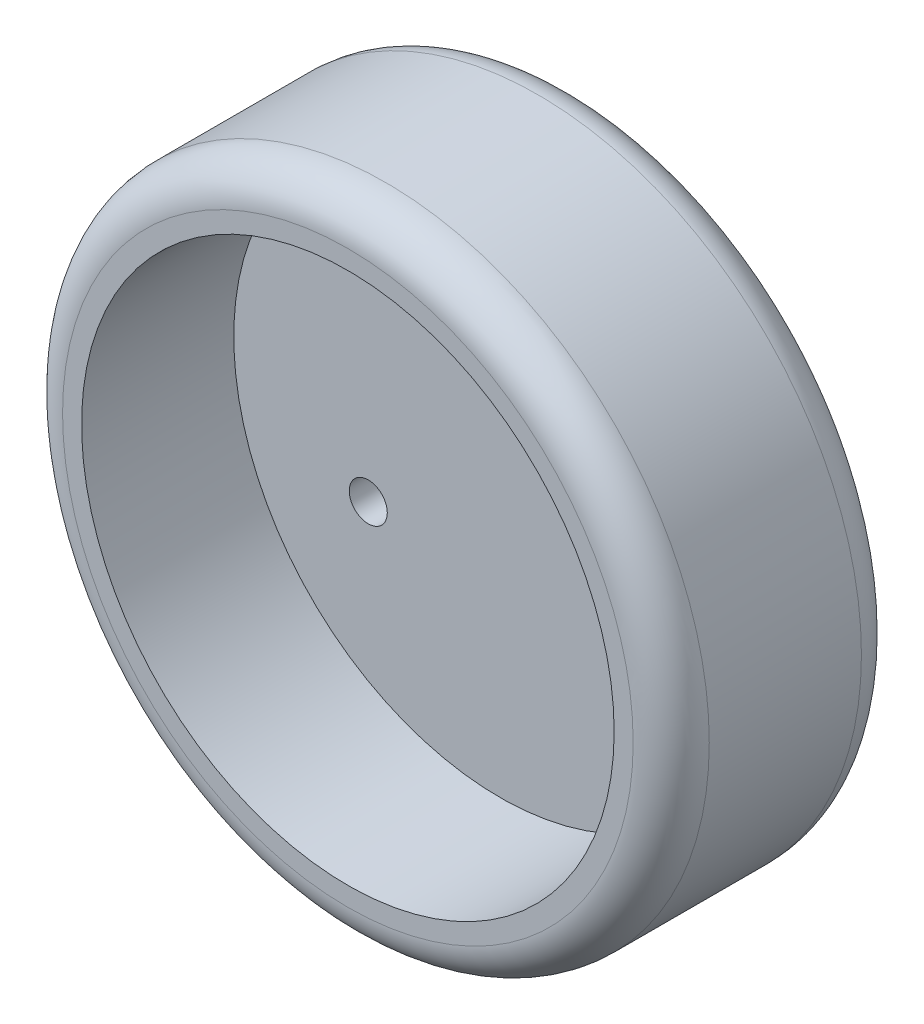
ISO-10303-21;
HEADER;
FILE_DESCRIPTION(('STEP AP214'),'2;1');
FILE_NAME('part.step','',(''),(''),'','','');
FILE_SCHEMA(('AUTOMOTIVE_DESIGN { 1 0 10303 214 1 1 1 1 }'));
ENDSEC;
DATA;
#1=APPLICATION_CONTEXT('core data for automotive mechanical design processes');
#2=APPLICATION_PROTOCOL_DEFINITION('international standard','automotive_design',2000,#1);
#3=PRODUCT_CONTEXT('',#1,'mechanical');
#4=PRODUCT('Part','Part','',(#3));
#5=PRODUCT_RELATED_PRODUCT_CATEGORY('part','',(#4));
#6=PRODUCT_DEFINITION_FORMATION('','',#4);
#7=PRODUCT_DEFINITION_CONTEXT('part definition',#1,'design');
#8=PRODUCT_DEFINITION('design','',#6,#7);
#9=PRODUCT_DEFINITION_SHAPE('','',#8);
#10=(LENGTH_UNIT() NAMED_UNIT(*) SI_UNIT(.MILLI.,.METRE.));
#11=(NAMED_UNIT(*) PLANE_ANGLE_UNIT() SI_UNIT($,.RADIAN.));
#12=(NAMED_UNIT(*) SI_UNIT($,.STERADIAN.) SOLID_ANGLE_UNIT());
#13=UNCERTAINTY_MEASURE_WITH_UNIT(LENGTH_MEASURE(1.E-05),#10,'distance_accuracy_value','');
#14=(GEOMETRIC_REPRESENTATION_CONTEXT(3) GLOBAL_UNCERTAINTY_ASSIGNED_CONTEXT((#13)) GLOBAL_UNIT_ASSIGNED_CONTEXT((#10,
#11,#12)) REPRESENTATION_CONTEXT('',''));
#15=CARTESIAN_POINT('',(0.,0.,0.));
#16=DIRECTION('',(0.,0.,1.));
#17=DIRECTION('',(1.,0.,0.));
#18=AXIS2_PLACEMENT_3D('',#15,#16,#17);
#19=CARTESIAN_POINT('',(0.,0.,30.));
#20=DIRECTION('',(0.,0.,-1.));
#21=DIRECTION('',(-1.,0.,0.));
#22=AXIS2_PLACEMENT_3D('',#19,#20,#21);
#23=CYLINDRICAL_SURFACE('',#22,42.5);
#24=CARTESIAN_POINT('',(0.,0.,5.));
#25=DIRECTION('',(0.,0.,1.));
#26=DIRECTION('',(1.,0.,0.));
#27=AXIS2_PLACEMENT_3D('',#24,#25,#26);
#28=CIRCLE('',#27,42.5);
#29=CARTESIAN_POINT('',(42.5,0.,5.));
#30=VERTEX_POINT('',#29);
#31=EDGE_CURVE('E47',#30,#30,#28,.T.);
#32=ORIENTED_EDGE('',*,*,#31,.T.);
#33=EDGE_LOOP('',(#32));
#34=FACE_BOUND('',#33,.T.);
#35=CARTESIAN_POINT('',(0.,0.,25.));
#36=DIRECTION('',(0.,0.,1.));
#37=DIRECTION('',(1.,0.,0.));
#38=AXIS2_PLACEMENT_3D('',#35,#36,#37);
#39=CIRCLE('',#38,42.5);
#40=CARTESIAN_POINT('',(42.5,0.,25.));
#41=VERTEX_POINT('',#40);
#42=EDGE_CURVE('E52',#41,#41,#39,.F.);
#43=ORIENTED_EDGE('',*,*,#42,.T.);
#44=EDGE_LOOP('',(#43));
#45=FACE_BOUND('',#44,.T.);
#46=ADVANCED_FACE('F36',(#34,#45),#23,.T.);
#47=CARTESIAN_POINT('',(0.,0.,30.));
#48=DIRECTION('',(0.,0.,1.));
#49=DIRECTION('',(1.,0.,0.));
#50=AXIS2_PLACEMENT_3D('',#47,#48,#49);
#51=PLANE('',#50);
#52=CARTESIAN_POINT('',(0.,0.,30.));
#53=DIRECTION('',(0.,0.,1.));
#54=DIRECTION('',(1.,0.,0.));
#55=AXIS2_PLACEMENT_3D('',#52,#53,#54);
#56=CIRCLE('',#55,37.5);
#57=CARTESIAN_POINT('',(37.5,0.,30.));
#58=VERTEX_POINT('',#57);
#59=EDGE_CURVE('E11',#58,#58,#56,.T.);
#60=ORIENTED_EDGE('',*,*,#59,.T.);
#61=EDGE_LOOP('',(#60));
#62=FACE_BOUND('',#61,.T.);
#63=CARTESIAN_POINT('',(0.,0.,30.));
#64=DIRECTION('',(0.,0.,1.));
#65=DIRECTION('',(1.,0.,0.));
#66=AXIS2_PLACEMENT_3D('',#63,#64,#65);
#67=CIRCLE('',#66,35.);
#68=CARTESIAN_POINT('',(35.,0.,30.));
#69=VERTEX_POINT('',#68);
#70=EDGE_CURVE('E56',#69,#69,#67,.T.);
#71=ORIENTED_EDGE('',*,*,#70,.F.);
#72=EDGE_LOOP('',(#71));
#73=FACE_BOUND('',#72,.T.);
#74=ADVANCED_FACE('F112',(#62,#73),#51,.T.);
#75=CARTESIAN_POINT('',(0.,0.,0.));
#76=DIRECTION('',(0.,0.,1.));
#77=DIRECTION('',(1.,0.,0.));
#78=AXIS2_PLACEMENT_3D('',#75,#76,#77);
#79=PLANE('',#78);
#80=CARTESIAN_POINT('',(0.,0.,0.));
#81=DIRECTION('',(0.,0.,1.));
#82=DIRECTION('',(1.,0.,0.));
#83=AXIS2_PLACEMENT_3D('',#80,#81,#82);
#84=CIRCLE('',#83,37.5);
#85=CARTESIAN_POINT('',(37.5,0.,0.));
#86=VERTEX_POINT('',#85);
#87=EDGE_CURVE('E44',#86,#86,#84,.F.);
#88=ORIENTED_EDGE('',*,*,#87,.T.);
#89=EDGE_LOOP('',(#88));
#90=FACE_BOUND('',#89,.T.);
#91=CARTESIAN_POINT('',(0.,20.,0.));
#92=DIRECTION('',(0.,0.,1.));
#93=DIRECTION('',(1.,0.,0.));
#94=AXIS2_PLACEMENT_3D('',#91,#92,#93);
#95=CIRCLE('',#94,2.5);
#96=CARTESIAN_POINT('',(2.5,20.,0.));
#97=VERTEX_POINT('',#96);
#98=EDGE_CURVE('E65',#97,#97,#95,.T.);
#99=ORIENTED_EDGE('',*,*,#98,.T.);
#100=EDGE_LOOP('',(#99));
#101=FACE_BOUND('',#100,.T.);
#102=CARTESIAN_POINT('',(17.3205080756887,-10.0000000000001,0.));
#103=DIRECTION('',(0.,0.,1.));
#104=DIRECTION('',(1.,0.,0.));
#105=AXIS2_PLACEMENT_3D('',#102,#103,#104);
#106=CIRCLE('',#105,2.5);
#107=CARTESIAN_POINT('',(19.8205080756887,-10.0000000000001,0.));
#108=VERTEX_POINT('',#107);
#109=EDGE_CURVE('E72',#108,#108,#106,.T.);
#110=ORIENTED_EDGE('',*,*,#109,.T.);
#111=EDGE_LOOP('',(#110));
#112=FACE_BOUND('',#111,.T.);
#113=CARTESIAN_POINT('',(-17.3205080756887,-10.0000000000001,0.));
#114=DIRECTION('',(0.,0.,1.));
#115=DIRECTION('',(1.,0.,0.));
#116=AXIS2_PLACEMENT_3D('',#113,#114,#115);
#117=CIRCLE('',#116,2.5);
#118=CARTESIAN_POINT('',(-14.8205080756887,-10.0000000000001,0.));
#119=VERTEX_POINT('',#118);
#120=EDGE_CURVE('E64',#119,#119,#117,.T.);
#121=ORIENTED_EDGE('',*,*,#120,.T.);
#122=EDGE_LOOP('',(#121));
#123=FACE_BOUND('',#122,.T.);
#124=ADVANCED_FACE('F84',(#90,#101,#112,#123),#79,.F.);
#125=CARTESIAN_POINT('',(0.,0.,10.));
#126=DIRECTION('',(0.,0.,1.));
#127=DIRECTION('',(1.,0.,0.));
#128=AXIS2_PLACEMENT_3D('',#125,#126,#127);
#129=CYLINDRICAL_SURFACE('',#128,35.);
#130=CARTESIAN_POINT('',(0.,0.,10.));
#131=DIRECTION('',(0.,0.,1.));
#132=DIRECTION('',(1.,0.,0.));
#133=AXIS2_PLACEMENT_3D('',#130,#131,#132);
#134=CIRCLE('',#133,35.);
#135=CARTESIAN_POINT('',(35.,0.,10.));
#136=VERTEX_POINT('',#135);
#137=EDGE_CURVE('E59',#136,#136,#134,.T.);
#138=ORIENTED_EDGE('',*,*,#137,.F.);
#139=EDGE_LOOP('',(#138));
#140=FACE_BOUND('',#139,.T.);
#141=ORIENTED_EDGE('',*,*,#70,.T.);
#142=EDGE_LOOP('',(#141));
#143=FACE_BOUND('',#142,.T.);
#144=ADVANCED_FACE('F98',(#140,#143),#129,.F.);
#145=CARTESIAN_POINT('',(0.,0.,10.));
#146=DIRECTION('',(0.,0.,1.));
#147=DIRECTION('',(1.,0.,0.));
#148=AXIS2_PLACEMENT_3D('',#145,#146,#147);
#149=PLANE('',#148);
#150=CARTESIAN_POINT('',(0.,20.,10.));
#151=DIRECTION('',(0.,0.,1.));
#152=DIRECTION('',(1.,0.,0.));
#153=AXIS2_PLACEMENT_3D('',#150,#151,#152);
#154=CIRCLE('',#153,2.5);
#155=CARTESIAN_POINT('',(2.5,20.,10.));
#156=VERTEX_POINT('',#155);
#157=EDGE_CURVE('E80',#156,#156,#154,.T.);
#158=ORIENTED_EDGE('',*,*,#157,.F.);
#159=EDGE_LOOP('',(#158));
#160=FACE_BOUND('',#159,.T.);
#161=CARTESIAN_POINT('',(17.3205080756887,-10.0000000000001,10.));
#162=DIRECTION('',(0.,0.,1.));
#163=DIRECTION('',(1.,0.,0.));
#164=AXIS2_PLACEMENT_3D('',#161,#162,#163);
#165=CIRCLE('',#164,2.5);
#166=CARTESIAN_POINT('',(19.8205080756887,-10.0000000000001,10.));
#167=VERTEX_POINT('',#166);
#168=EDGE_CURVE('E74',#167,#167,#165,.T.);
#169=ORIENTED_EDGE('',*,*,#168,.F.);
#170=EDGE_LOOP('',(#169));
#171=FACE_BOUND('',#170,.T.);
#172=CARTESIAN_POINT('',(-17.3205080756887,-10.0000000000001,10.));
#173=DIRECTION('',(0.,0.,1.));
#174=DIRECTION('',(1.,0.,0.));
#175=AXIS2_PLACEMENT_3D('',#172,#173,#174);
#176=CIRCLE('',#175,2.5);
#177=CARTESIAN_POINT('',(-14.8205080756887,-10.0000000000001,10.));
#178=VERTEX_POINT('',#177);
#179=EDGE_CURVE('E69',#178,#178,#176,.T.);
#180=ORIENTED_EDGE('',*,*,#179,.F.);
#181=EDGE_LOOP('',(#180));
#182=FACE_BOUND('',#181,.T.);
#183=ORIENTED_EDGE('',*,*,#137,.T.);
#184=EDGE_LOOP('',(#183));
#185=FACE_BOUND('',#184,.T.);
#186=ADVANCED_FACE('F94',(#160,#171,#182,#185),#149,.T.);
#187=CARTESIAN_POINT('',(-17.3205080756887,-10.0000000000001,0.));
#188=DIRECTION('',(0.,0.,1.));
#189=DIRECTION('',(1.,0.,0.));
#190=AXIS2_PLACEMENT_3D('',#187,#188,#189);
#191=CYLINDRICAL_SURFACE('',#190,2.5);
#192=ORIENTED_EDGE('',*,*,#120,.F.);
#193=EDGE_LOOP('',(#192));
#194=FACE_BOUND('',#193,.T.);
#195=ORIENTED_EDGE('',*,*,#179,.T.);
#196=EDGE_LOOP('',(#195));
#197=FACE_BOUND('',#196,.T.);
#198=ADVANCED_FACE('F100',(#194,#197),#191,.F.);
#199=CARTESIAN_POINT('',(17.3205080756887,-10.0000000000001,0.));
#200=DIRECTION('',(0.,0.,1.));
#201=DIRECTION('',(1.,0.,0.));
#202=AXIS2_PLACEMENT_3D('',#199,#200,#201);
#203=CYLINDRICAL_SURFACE('',#202,2.5);
#204=ORIENTED_EDGE('',*,*,#109,.F.);
#205=EDGE_LOOP('',(#204));
#206=FACE_BOUND('',#205,.T.);
#207=ORIENTED_EDGE('',*,*,#168,.T.);
#208=EDGE_LOOP('',(#207));
#209=FACE_BOUND('',#208,.T.);
#210=ADVANCED_FACE('F89',(#206,#209),#203,.F.);
#211=CARTESIAN_POINT('',(0.,20.,0.));
#212=DIRECTION('',(0.,0.,1.));
#213=DIRECTION('',(1.,0.,0.));
#214=AXIS2_PLACEMENT_3D('',#211,#212,#213);
#215=CYLINDRICAL_SURFACE('',#214,2.5);
#216=ORIENTED_EDGE('',*,*,#98,.F.);
#217=EDGE_LOOP('',(#216));
#218=FACE_BOUND('',#217,.T.);
#219=ORIENTED_EDGE('',*,*,#157,.T.);
#220=EDGE_LOOP('',(#219));
#221=FACE_BOUND('',#220,.T.);
#222=ADVANCED_FACE('F88',(#218,#221),#215,.F.);
#223=CARTESIAN_POINT('',(0.,0.,5.));
#224=DIRECTION('',(0.,0.,1.));
#225=DIRECTION('',(1.,0.,0.));
#226=AXIS2_PLACEMENT_3D('',#223,#224,#225);
#227=TOROIDAL_SURFACE('',#226,37.5,5.);
#228=ORIENTED_EDGE('',*,*,#87,.F.);
#229=EDGE_LOOP('',(#228));
#230=FACE_BOUND('',#229,.T.);
#231=ORIENTED_EDGE('',*,*,#31,.F.);
#232=EDGE_LOOP('',(#231));
#233=FACE_BOUND('',#232,.T.);
#234=ADVANCED_FACE('F90',(#230,#233),#227,.T.);
#235=CARTESIAN_POINT('',(0.,0.,25.));
#236=DIRECTION('',(0.,0.,1.));
#237=DIRECTION('',(1.,0.,0.));
#238=AXIS2_PLACEMENT_3D('',#235,#236,#237);
#239=TOROIDAL_SURFACE('',#238,37.5,5.);
#240=ORIENTED_EDGE('',*,*,#42,.F.);
#241=EDGE_LOOP('',(#240));
#242=FACE_BOUND('',#241,.T.);
#243=ORIENTED_EDGE('',*,*,#59,.F.);
#244=EDGE_LOOP('',(#243));
#245=FACE_BOUND('',#244,.T.);
#246=ADVANCED_FACE('F37',(#242,#245),#239,.T.);
#247=CLOSED_SHELL('',(#46,#74,#124,#144,#186,#198,#210,#222,#234,#246));
#248=MANIFOLD_SOLID_BREP('B2',#247);
#249=ADVANCED_BREP_SHAPE_REPRESENTATION('',(#18,#248),#14);
#250=SHAPE_DEFINITION_REPRESENTATION(#9,#249);
ENDSEC;
END-ISO-10303-21;
